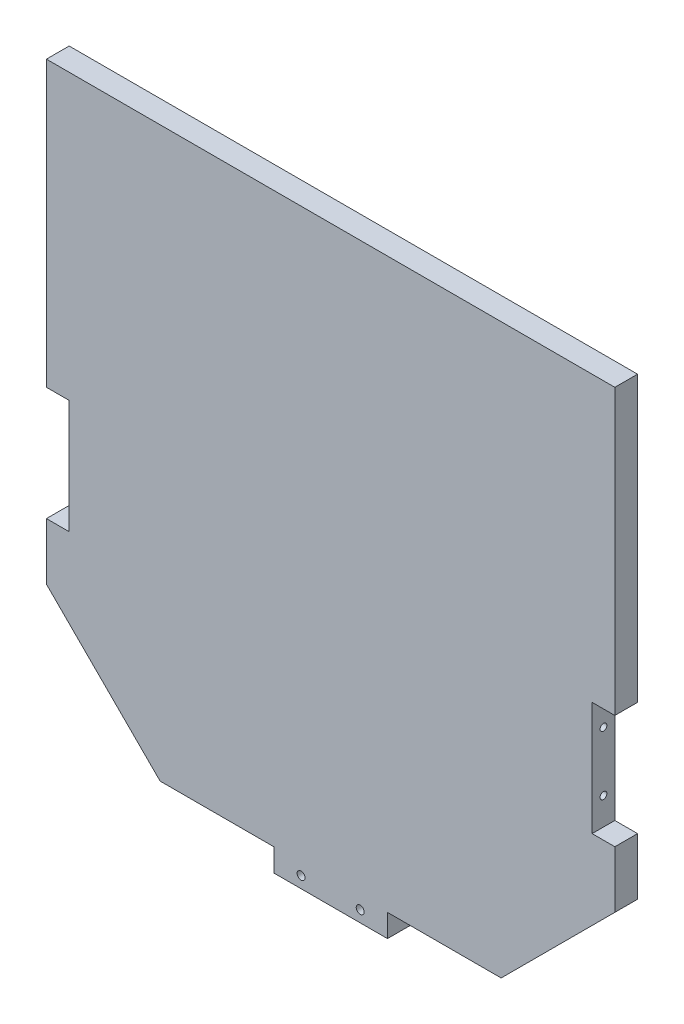
ISO-10303-21;
HEADER;
FILE_DESCRIPTION(('STEP AP214'),'2;1');
FILE_NAME('part.step','',(''),(''),'','','');
FILE_SCHEMA(('AUTOMOTIVE_DESIGN { 1 0 10303 214 1 1 1 1 }'));
ENDSEC;
DATA;
#1=APPLICATION_CONTEXT('core data for automotive mechanical design processes');
#2=APPLICATION_PROTOCOL_DEFINITION('international standard','automotive_design',2000,#1);
#3=PRODUCT_CONTEXT('',#1,'mechanical');
#4=PRODUCT('Part','Part','',(#3));
#5=PRODUCT_RELATED_PRODUCT_CATEGORY('part','',(#4));
#6=PRODUCT_DEFINITION_FORMATION('','',#4);
#7=PRODUCT_DEFINITION_CONTEXT('part definition',#1,'design');
#8=PRODUCT_DEFINITION('design','',#6,#7);
#9=PRODUCT_DEFINITION_SHAPE('','',#8);
#10=(LENGTH_UNIT() NAMED_UNIT(*) SI_UNIT(.MILLI.,.METRE.));
#11=(NAMED_UNIT(*) PLANE_ANGLE_UNIT() SI_UNIT($,.RADIAN.));
#12=(NAMED_UNIT(*) SI_UNIT($,.STERADIAN.) SOLID_ANGLE_UNIT());
#13=UNCERTAINTY_MEASURE_WITH_UNIT(LENGTH_MEASURE(1.E-05),#10,'distance_accuracy_value','');
#14=(GEOMETRIC_REPRESENTATION_CONTEXT(3) GLOBAL_UNCERTAINTY_ASSIGNED_CONTEXT((#13)) GLOBAL_UNIT_ASSIGNED_CONTEXT((#10,
#11,#12)) REPRESENTATION_CONTEXT('',''));
#15=CARTESIAN_POINT('',(0.,0.,0.));
#16=DIRECTION('',(0.,0.,1.));
#17=DIRECTION('',(1.,0.,0.));
#18=AXIS2_PLACEMENT_3D('',#15,#16,#17);
#19=CARTESIAN_POINT('',(-115.,75.,10.));
#20=DIRECTION('',(1.,0.,0.));
#21=DIRECTION('',(0.,0.,-1.));
#22=AXIS2_PLACEMENT_3D('',#19,#20,#21);
#23=PLANE('',#22);
#24=CARTESIAN_POINT('',(-115.,113.,5.));
#25=DIRECTION('',(1.,0.,0.));
#26=DIRECTION('',(0.,1.,0.));
#27=AXIS2_PLACEMENT_3D('',#24,#25,#26);
#28=CIRCLE('',#27,1.5);
#29=CARTESIAN_POINT('',(-115.,114.5,5.));
#30=VERTEX_POINT('',#29);
#31=EDGE_CURVE('E438',#30,#30,#28,.T.);
#32=ORIENTED_EDGE('',*,*,#31,.T.);
#33=EDGE_LOOP('',(#32));
#34=FACE_BOUND('',#33,.T.);
#35=DIRECTION('',(0.,-1.,0.));
#36=VECTOR('',#35,1.);
#37=CARTESIAN_POINT('',(-115.,75.,0.));
#38=LINE('',#37,#36);
#39=CARTESIAN_POINT('',(-115.,125.,0.));
#40=VERTEX_POINT('',#39);
#41=CARTESIAN_POINT('',(-115.,75.,0.));
#42=VERTEX_POINT('',#41);
#43=EDGE_CURVE('E217',#40,#42,#38,.T.);
#44=ORIENTED_EDGE('',*,*,#43,.T.);
#45=DIRECTION('',(0.,0.,-1.));
#46=VECTOR('',#45,1.);
#47=CARTESIAN_POINT('',(-115.,75.,10.));
#48=LINE('',#47,#46);
#49=CARTESIAN_POINT('',(-115.,75.,10.));
#50=VERTEX_POINT('',#49);
#51=EDGE_CURVE('E228',#50,#42,#48,.T.);
#52=ORIENTED_EDGE('',*,*,#51,.F.);
#53=DIRECTION('',(0.,-1.,0.));
#54=VECTOR('',#53,1.);
#55=CARTESIAN_POINT('',(-115.,75.,10.));
#56=LINE('',#55,#54);
#57=CARTESIAN_POINT('',(-115.,125.,10.));
#58=VERTEX_POINT('',#57);
#59=EDGE_CURVE('E308',#58,#50,#56,.T.);
#60=ORIENTED_EDGE('',*,*,#59,.F.);
#61=DIRECTION('',(0.,0.,-1.));
#62=VECTOR('',#61,1.);
#63=CARTESIAN_POINT('',(-115.,125.,10.));
#64=LINE('',#63,#62);
#65=EDGE_CURVE('E231',#58,#40,#64,.T.);
#66=ORIENTED_EDGE('',*,*,#65,.T.);
#67=EDGE_LOOP('',(#44,#52,#60,#66));
#68=FACE_BOUND('',#67,.T.);
#69=CARTESIAN_POINT('',(-115.,87.,5.));
#70=DIRECTION('',(1.,0.,0.));
#71=DIRECTION('',(0.,1.,0.));
#72=AXIS2_PLACEMENT_3D('',#69,#70,#71);
#73=CIRCLE('',#72,1.5);
#74=CARTESIAN_POINT('',(-115.,88.5,5.));
#75=VERTEX_POINT('',#74);
#76=EDGE_CURVE('E439',#75,#75,#73,.T.);
#77=ORIENTED_EDGE('',*,*,#76,.T.);
#78=EDGE_LOOP('',(#77));
#79=FACE_BOUND('',#78,.T.);
#80=ADVANCED_FACE('F31',(#34,#68,#79),#23,.F.);
#81=CARTESIAN_POINT('',(-25.,-10.,10.));
#82=DIRECTION('',(0.,0.,1.));
#83=DIRECTION('',(1.,0.,0.));
#84=AXIS2_PLACEMENT_3D('',#81,#82,#83);
#85=PLANE('',#84);
#86=CARTESIAN_POINT('',(-13.,-5.,10.));
#87=DIRECTION('',(0.,0.,1.));
#88=DIRECTION('',(1.,0.,0.));
#89=AXIS2_PLACEMENT_3D('',#86,#87,#88);
#90=CIRCLE('',#89,1.75);
#91=CARTESIAN_POINT('',(-11.25,-5.,10.));
#92=VERTEX_POINT('',#91);
#93=EDGE_CURVE('E193',#92,#92,#90,.T.);
#94=ORIENTED_EDGE('',*,*,#93,.F.);
#95=EDGE_LOOP('',(#94));
#96=FACE_BOUND('',#95,.T.);
#97=DIRECTION('',(0.,-1.,0.));
#98=VECTOR('',#97,1.);
#99=CARTESIAN_POINT('',(-25.,0.,10.));
#100=LINE('',#99,#98);
#101=CARTESIAN_POINT('',(-25.,0.,10.));
#102=VERTEX_POINT('',#101);
#103=CARTESIAN_POINT('',(-25.,-10.,10.));
#104=VERTEX_POINT('',#103);
#105=EDGE_CURVE('E224',#102,#104,#100,.T.);
#106=ORIENTED_EDGE('',*,*,#105,.T.);
#107=DIRECTION('',(1.,0.,0.));
#108=VECTOR('',#107,1.);
#109=CARTESIAN_POINT('',(-25.,-10.,10.));
#110=LINE('',#109,#108);
#111=CARTESIAN_POINT('',(25.,-10.,10.));
#112=VERTEX_POINT('',#111);
#113=EDGE_CURVE('E121',#104,#112,#110,.T.);
#114=ORIENTED_EDGE('',*,*,#113,.T.);
#115=DIRECTION('',(0.,1.,0.));
#116=VECTOR('',#115,1.);
#117=CARTESIAN_POINT('',(25.,0.,10.));
#118=LINE('',#117,#116);
#119=CARTESIAN_POINT('',(25.,0.,10.));
#120=VERTEX_POINT('',#119);
#121=EDGE_CURVE('E269',#112,#120,#118,.T.);
#122=ORIENTED_EDGE('',*,*,#121,.T.);
#123=DIRECTION('',(1.,0.,0.));
#124=VECTOR('',#123,1.);
#125=CARTESIAN_POINT('',(75.,0.,10.));
#126=LINE('',#125,#124);
#127=CARTESIAN_POINT('',(75.,0.,10.));
#128=VERTEX_POINT('',#127);
#129=EDGE_CURVE('E288',#120,#128,#126,.T.);
#130=ORIENTED_EDGE('',*,*,#129,.T.);
#131=DIRECTION('',(0.707106781186548,0.707106781186547,0.));
#132=VECTOR('',#131,1.);
#133=CARTESIAN_POINT('',(125.,50.,10.));
#134=LINE('',#133,#132);
#135=CARTESIAN_POINT('',(125.,50.,10.));
#136=VERTEX_POINT('',#135);
#137=EDGE_CURVE('E285',#128,#136,#134,.T.);
#138=ORIENTED_EDGE('',*,*,#137,.T.);
#139=DIRECTION('',(0.,1.,0.));
#140=VECTOR('',#139,1.);
#141=CARTESIAN_POINT('',(125.,75.,10.));
#142=LINE('',#141,#140);
#143=CARTESIAN_POINT('',(125.,75.,10.));
#144=VERTEX_POINT('',#143);
#145=EDGE_CURVE('E287',#136,#144,#142,.T.);
#146=ORIENTED_EDGE('',*,*,#145,.T.);
#147=DIRECTION('',(-1.,0.,0.));
#148=VECTOR('',#147,1.);
#149=CARTESIAN_POINT('',(125.,75.,10.));
#150=LINE('',#149,#148);
#151=CARTESIAN_POINT('',(115.,75.,10.));
#152=VERTEX_POINT('',#151);
#153=EDGE_CURVE('E290',#144,#152,#150,.T.);
#154=ORIENTED_EDGE('',*,*,#153,.T.);
#155=DIRECTION('',(0.,1.,0.));
#156=VECTOR('',#155,1.);
#157=CARTESIAN_POINT('',(115.,75.,10.));
#158=LINE('',#157,#156);
#159=CARTESIAN_POINT('',(115.,125.,10.));
#160=VERTEX_POINT('',#159);
#161=EDGE_CURVE('E296',#152,#160,#158,.T.);
#162=ORIENTED_EDGE('',*,*,#161,.T.);
#163=DIRECTION('',(1.,0.,0.));
#164=VECTOR('',#163,1.);
#165=CARTESIAN_POINT('',(115.,125.,10.));
#166=LINE('',#165,#164);
#167=CARTESIAN_POINT('',(125.,125.,10.));
#168=VERTEX_POINT('',#167);
#169=EDGE_CURVE('E298',#160,#168,#166,.T.);
#170=ORIENTED_EDGE('',*,*,#169,.T.);
#171=DIRECTION('',(0.,1.,0.));
#172=VECTOR('',#171,1.);
#173=CARTESIAN_POINT('',(125.,125.,10.));
#174=LINE('',#173,#172);
#175=CARTESIAN_POINT('',(125.,250.,10.));
#176=VERTEX_POINT('',#175);
#177=EDGE_CURVE('E300',#168,#176,#174,.T.);
#178=ORIENTED_EDGE('',*,*,#177,.T.);
#179=DIRECTION('',(-1.,0.,0.));
#180=VECTOR('',#179,1.);
#181=CARTESIAN_POINT('',(-125.,250.,10.));
#182=LINE('',#181,#180);
#183=CARTESIAN_POINT('',(-125.,250.,10.));
#184=VERTEX_POINT('',#183);
#185=EDGE_CURVE('E302',#176,#184,#182,.T.);
#186=ORIENTED_EDGE('',*,*,#185,.T.);
#187=DIRECTION('',(0.,-1.,0.));
#188=VECTOR('',#187,1.);
#189=CARTESIAN_POINT('',(-125.,125.,10.));
#190=LINE('',#189,#188);
#191=CARTESIAN_POINT('',(-125.,125.,10.));
#192=VERTEX_POINT('',#191);
#193=EDGE_CURVE('E304',#184,#192,#190,.T.);
#194=ORIENTED_EDGE('',*,*,#193,.T.);
#195=DIRECTION('',(1.,0.,0.));
#196=VECTOR('',#195,1.);
#197=CARTESIAN_POINT('',(-115.,125.,10.));
#198=LINE('',#197,#196);
#199=EDGE_CURVE('E306',#192,#58,#198,.T.);
#200=ORIENTED_EDGE('',*,*,#199,.T.);
#201=ORIENTED_EDGE('',*,*,#59,.T.);
#202=DIRECTION('',(-1.,0.,0.));
#203=VECTOR('',#202,1.);
#204=CARTESIAN_POINT('',(-125.,75.,10.));
#205=LINE('',#204,#203);
#206=CARTESIAN_POINT('',(-125.,75.,10.));
#207=VERTEX_POINT('',#206);
#208=EDGE_CURVE('E171',#50,#207,#205,.T.);
#209=ORIENTED_EDGE('',*,*,#208,.T.);
#210=DIRECTION('',(0.,-1.,0.));
#211=VECTOR('',#210,1.);
#212=CARTESIAN_POINT('',(-125.,75.,10.));
#213=LINE('',#212,#211);
#214=CARTESIAN_POINT('',(-125.,50.,10.));
#215=VERTEX_POINT('',#214);
#216=EDGE_CURVE('E164',#207,#215,#213,.T.);
#217=ORIENTED_EDGE('',*,*,#216,.T.);
#218=DIRECTION('',(0.707106781186548,-0.707106781186547,0.));
#219=VECTOR('',#218,1.);
#220=CARTESIAN_POINT('',(-125.,50.,10.));
#221=LINE('',#220,#219);
#222=CARTESIAN_POINT('',(-75.,0.,10.));
#223=VERTEX_POINT('',#222);
#224=EDGE_CURVE('E169',#215,#223,#221,.T.);
#225=ORIENTED_EDGE('',*,*,#224,.T.);
#226=DIRECTION('',(1.,0.,0.));
#227=VECTOR('',#226,1.);
#228=CARTESIAN_POINT('',(-75.,0.,10.));
#229=LINE('',#228,#227);
#230=EDGE_CURVE('E48',#223,#102,#229,.T.);
#231=ORIENTED_EDGE('',*,*,#230,.T.);
#232=EDGE_LOOP('',(#106,#114,#122,#130,#138,#146,#154,#162,#170,#178,#186,#194,#200,#201,#209,
#217,#225,#231));
#233=FACE_BOUND('',#232,.T.);
#234=CARTESIAN_POINT('',(13.,-5.,10.));
#235=DIRECTION('',(0.,0.,1.));
#236=DIRECTION('',(1.,0.,0.));
#237=AXIS2_PLACEMENT_3D('',#234,#235,#236);
#238=CIRCLE('',#237,1.75);
#239=CARTESIAN_POINT('',(14.75,-5.,10.));
#240=VERTEX_POINT('',#239);
#241=EDGE_CURVE('E461',#240,#240,#238,.T.);
#242=ORIENTED_EDGE('',*,*,#241,.F.);
#243=EDGE_LOOP('',(#242));
#244=FACE_BOUND('',#243,.T.);
#245=ADVANCED_FACE('F166',(#96,#233,#244),#85,.T.);
#246=CARTESIAN_POINT('',(-25.,-10.,0.));
#247=DIRECTION('',(0.,0.,1.));
#248=DIRECTION('',(1.,0.,0.));
#249=AXIS2_PLACEMENT_3D('',#246,#247,#248);
#250=PLANE('',#249);
#251=CARTESIAN_POINT('',(-13.,-5.,0.));
#252=DIRECTION('',(0.,0.,1.));
#253=DIRECTION('',(1.,0.,0.));
#254=AXIS2_PLACEMENT_3D('',#251,#252,#253);
#255=CIRCLE('',#254,1.75);
#256=CARTESIAN_POINT('',(-11.25,-5.,0.));
#257=VERTEX_POINT('',#256);
#258=EDGE_CURVE('E464',#257,#257,#255,.T.);
#259=ORIENTED_EDGE('',*,*,#258,.T.);
#260=EDGE_LOOP('',(#259));
#261=FACE_BOUND('',#260,.T.);
#262=DIRECTION('',(0.,-1.,0.));
#263=VECTOR('',#262,1.);
#264=CARTESIAN_POINT('',(-25.,0.,0.));
#265=LINE('',#264,#263);
#266=CARTESIAN_POINT('',(-25.,0.,0.));
#267=VERTEX_POINT('',#266);
#268=CARTESIAN_POINT('',(-25.,-10.,0.));
#269=VERTEX_POINT('',#268);
#270=EDGE_CURVE('E189',#267,#269,#265,.T.);
#271=ORIENTED_EDGE('',*,*,#270,.F.);
#272=DIRECTION('',(1.,0.,0.));
#273=VECTOR('',#272,1.);
#274=CARTESIAN_POINT('',(-75.,0.,0.));
#275=LINE('',#274,#273);
#276=CARTESIAN_POINT('',(-75.,0.,0.));
#277=VERTEX_POINT('',#276);
#278=EDGE_CURVE('E113',#277,#267,#275,.T.);
#279=ORIENTED_EDGE('',*,*,#278,.F.);
#280=DIRECTION('',(0.707106781186548,-0.707106781186547,0.));
#281=VECTOR('',#280,1.);
#282=CARTESIAN_POINT('',(-125.,50.,0.));
#283=LINE('',#282,#281);
#284=CARTESIAN_POINT('',(-125.,50.,0.));
#285=VERTEX_POINT('',#284);
#286=EDGE_CURVE('E107',#285,#277,#283,.T.);
#287=ORIENTED_EDGE('',*,*,#286,.F.);
#288=DIRECTION('',(0.,-1.,0.));
#289=VECTOR('',#288,1.);
#290=CARTESIAN_POINT('',(-125.,75.,0.));
#291=LINE('',#290,#289);
#292=CARTESIAN_POINT('',(-125.,75.,0.));
#293=VERTEX_POINT('',#292);
#294=EDGE_CURVE('E179',#293,#285,#291,.T.);
#295=ORIENTED_EDGE('',*,*,#294,.F.);
#296=DIRECTION('',(-1.,0.,0.));
#297=VECTOR('',#296,1.);
#298=CARTESIAN_POINT('',(-125.,75.,0.));
#299=LINE('',#298,#297);
#300=EDGE_CURVE('E219',#42,#293,#299,.T.);
#301=ORIENTED_EDGE('',*,*,#300,.F.);
#302=ORIENTED_EDGE('',*,*,#43,.F.);
#303=DIRECTION('',(1.,0.,0.));
#304=VECTOR('',#303,1.);
#305=CARTESIAN_POINT('',(-115.,125.,0.));
#306=LINE('',#305,#304);
#307=CARTESIAN_POINT('',(-125.,125.,0.));
#308=VERTEX_POINT('',#307);
#309=EDGE_CURVE('E215',#308,#40,#306,.T.);
#310=ORIENTED_EDGE('',*,*,#309,.F.);
#311=DIRECTION('',(0.,-1.,0.));
#312=VECTOR('',#311,1.);
#313=CARTESIAN_POINT('',(-125.,125.,0.));
#314=LINE('',#313,#312);
#315=CARTESIAN_POINT('',(-125.,250.,0.));
#316=VERTEX_POINT('',#315);
#317=EDGE_CURVE('E213',#316,#308,#314,.T.);
#318=ORIENTED_EDGE('',*,*,#317,.F.);
#319=DIRECTION('',(-1.,0.,0.));
#320=VECTOR('',#319,1.);
#321=CARTESIAN_POINT('',(-125.,250.,0.));
#322=LINE('',#321,#320);
#323=CARTESIAN_POINT('',(125.,250.,0.));
#324=VERTEX_POINT('',#323);
#325=EDGE_CURVE('E211',#324,#316,#322,.T.);
#326=ORIENTED_EDGE('',*,*,#325,.F.);
#327=DIRECTION('',(0.,1.,0.));
#328=VECTOR('',#327,1.);
#329=CARTESIAN_POINT('',(125.,125.,0.));
#330=LINE('',#329,#328);
#331=CARTESIAN_POINT('',(125.,125.,0.));
#332=VERTEX_POINT('',#331);
#333=EDGE_CURVE('E209',#332,#324,#330,.T.);
#334=ORIENTED_EDGE('',*,*,#333,.F.);
#335=DIRECTION('',(1.,0.,0.));
#336=VECTOR('',#335,1.);
#337=CARTESIAN_POINT('',(115.,125.,0.));
#338=LINE('',#337,#336);
#339=CARTESIAN_POINT('',(115.,125.,0.));
#340=VERTEX_POINT('',#339);
#341=EDGE_CURVE('E207',#340,#332,#338,.T.);
#342=ORIENTED_EDGE('',*,*,#341,.F.);
#343=DIRECTION('',(0.,1.,0.));
#344=VECTOR('',#343,1.);
#345=CARTESIAN_POINT('',(115.,75.,0.));
#346=LINE('',#345,#344);
#347=CARTESIAN_POINT('',(115.,75.,0.));
#348=VERTEX_POINT('',#347);
#349=EDGE_CURVE('E205',#348,#340,#346,.T.);
#350=ORIENTED_EDGE('',*,*,#349,.F.);
#351=DIRECTION('',(-1.,0.,0.));
#352=VECTOR('',#351,1.);
#353=CARTESIAN_POINT('',(125.,75.,0.));
#354=LINE('',#353,#352);
#355=CARTESIAN_POINT('',(125.,75.,0.));
#356=VERTEX_POINT('',#355);
#357=EDGE_CURVE('E203',#356,#348,#354,.T.);
#358=ORIENTED_EDGE('',*,*,#357,.F.);
#359=DIRECTION('',(0.,1.,0.));
#360=VECTOR('',#359,1.);
#361=CARTESIAN_POINT('',(125.,75.,0.));
#362=LINE('',#361,#360);
#363=CARTESIAN_POINT('',(125.,50.,0.));
#364=VERTEX_POINT('',#363);
#365=EDGE_CURVE('E201',#364,#356,#362,.T.);
#366=ORIENTED_EDGE('',*,*,#365,.F.);
#367=DIRECTION('',(0.707106781186548,0.707106781186547,0.));
#368=VECTOR('',#367,1.);
#369=CARTESIAN_POINT('',(125.,50.,0.));
#370=LINE('',#369,#368);
#371=CARTESIAN_POINT('',(75.,0.,0.));
#372=VERTEX_POINT('',#371);
#373=EDGE_CURVE('E199',#372,#364,#370,.T.);
#374=ORIENTED_EDGE('',*,*,#373,.F.);
#375=DIRECTION('',(1.,0.,0.));
#376=VECTOR('',#375,1.);
#377=CARTESIAN_POINT('',(75.,0.,0.));
#378=LINE('',#377,#376);
#379=CARTESIAN_POINT('',(25.,0.,0.));
#380=VERTEX_POINT('',#379);
#381=EDGE_CURVE('E197',#380,#372,#378,.T.);
#382=ORIENTED_EDGE('',*,*,#381,.F.);
#383=DIRECTION('',(0.,1.,0.));
#384=VECTOR('',#383,1.);
#385=CARTESIAN_POINT('',(25.,0.,0.));
#386=LINE('',#385,#384);
#387=CARTESIAN_POINT('',(25.,-10.,0.));
#388=VERTEX_POINT('',#387);
#389=EDGE_CURVE('E195',#388,#380,#386,.T.);
#390=ORIENTED_EDGE('',*,*,#389,.F.);
#391=DIRECTION('',(1.,0.,0.));
#392=VECTOR('',#391,1.);
#393=CARTESIAN_POINT('',(-25.,-10.,0.));
#394=LINE('',#393,#392);
#395=EDGE_CURVE('E192',#269,#388,#394,.T.);
#396=ORIENTED_EDGE('',*,*,#395,.F.);
#397=EDGE_LOOP('',(#271,#279,#287,#295,#301,#302,#310,#318,#326,#334,#342,#350,#358,#366,#374,
#382,#390,#396));
#398=FACE_BOUND('',#397,.T.);
#399=CARTESIAN_POINT('',(13.,-5.,0.));
#400=DIRECTION('',(0.,0.,1.));
#401=DIRECTION('',(1.,0.,0.));
#402=AXIS2_PLACEMENT_3D('',#399,#400,#401);
#403=CIRCLE('',#402,1.75);
#404=CARTESIAN_POINT('',(14.75,-5.,0.));
#405=VERTEX_POINT('',#404);
#406=EDGE_CURVE('E458',#405,#405,#403,.T.);
#407=ORIENTED_EDGE('',*,*,#406,.T.);
#408=EDGE_LOOP('',(#407));
#409=FACE_BOUND('',#408,.T.);
#410=ADVANCED_FACE('F273',(#261,#398,#409),#250,.F.);
#411=CARTESIAN_POINT('',(-25.,0.,10.));
#412=DIRECTION('',(1.,0.,0.));
#413=DIRECTION('',(0.,0.,-1.));
#414=AXIS2_PLACEMENT_3D('',#411,#412,#413);
#415=PLANE('',#414);
#416=ORIENTED_EDGE('',*,*,#270,.T.);
#417=DIRECTION('',(0.,0.,-1.));
#418=VECTOR('',#417,1.);
#419=CARTESIAN_POINT('',(-25.,-10.,10.));
#420=LINE('',#419,#418);
#421=EDGE_CURVE('E11',#104,#269,#420,.T.);
#422=ORIENTED_EDGE('',*,*,#421,.F.);
#423=ORIENTED_EDGE('',*,*,#105,.F.);
#424=DIRECTION('',(0.,0.,-1.));
#425=VECTOR('',#424,1.);
#426=CARTESIAN_POINT('',(-25.,0.,10.));
#427=LINE('',#426,#425);
#428=EDGE_CURVE('E185',#102,#267,#427,.T.);
#429=ORIENTED_EDGE('',*,*,#428,.T.);
#430=EDGE_LOOP('',(#416,#422,#423,#429));
#431=FACE_BOUND('',#430,.T.);
#432=ADVANCED_FACE('F33',(#431),#415,.F.);
#433=CARTESIAN_POINT('',(-25.,-10.,10.));
#434=DIRECTION('',(0.,1.,0.));
#435=DIRECTION('',(-1.,0.,0.));
#436=AXIS2_PLACEMENT_3D('',#433,#434,#435);
#437=PLANE('',#436);
#438=ORIENTED_EDGE('',*,*,#395,.T.);
#439=DIRECTION('',(0.,0.,-1.));
#440=VECTOR('',#439,1.);
#441=CARTESIAN_POINT('',(25.,-10.,10.));
#442=LINE('',#441,#440);
#443=EDGE_CURVE('E40',#112,#388,#442,.T.);
#444=ORIENTED_EDGE('',*,*,#443,.F.);
#445=ORIENTED_EDGE('',*,*,#113,.F.);
#446=ORIENTED_EDGE('',*,*,#421,.T.);
#447=EDGE_LOOP('',(#438,#444,#445,#446));
#448=FACE_BOUND('',#447,.T.);
#449=ADVANCED_FACE('F386',(#448),#437,.F.);
#450=CARTESIAN_POINT('',(25.,0.,10.));
#451=DIRECTION('',(-1.,0.,0.));
#452=DIRECTION('',(0.,-1.,0.));
#453=AXIS2_PLACEMENT_3D('',#450,#451,#452);
#454=PLANE('',#453);
#455=ORIENTED_EDGE('',*,*,#389,.T.);
#456=DIRECTION('',(0.,0.,-1.));
#457=VECTOR('',#456,1.);
#458=CARTESIAN_POINT('',(25.,0.,10.));
#459=LINE('',#458,#457);
#460=EDGE_CURVE('E261',#120,#380,#459,.T.);
#461=ORIENTED_EDGE('',*,*,#460,.F.);
#462=ORIENTED_EDGE('',*,*,#121,.F.);
#463=ORIENTED_EDGE('',*,*,#443,.T.);
#464=EDGE_LOOP('',(#455,#461,#462,#463));
#465=FACE_BOUND('',#464,.T.);
#466=ADVANCED_FACE('F267',(#465),#454,.F.);
#467=CARTESIAN_POINT('',(75.,0.,10.));
#468=DIRECTION('',(0.,1.,0.));
#469=DIRECTION('',(-1.,0.,0.));
#470=AXIS2_PLACEMENT_3D('',#467,#468,#469);
#471=PLANE('',#470);
#472=ORIENTED_EDGE('',*,*,#381,.T.);
#473=DIRECTION('',(0.,0.,-1.));
#474=VECTOR('',#473,1.);
#475=CARTESIAN_POINT('',(75.,0.,10.));
#476=LINE('',#475,#474);
#477=EDGE_CURVE('E258',#128,#372,#476,.T.);
#478=ORIENTED_EDGE('',*,*,#477,.F.);
#479=ORIENTED_EDGE('',*,*,#129,.F.);
#480=ORIENTED_EDGE('',*,*,#460,.T.);
#481=EDGE_LOOP('',(#472,#478,#479,#480));
#482=FACE_BOUND('',#481,.T.);
#483=ADVANCED_FACE('F279',(#482),#471,.F.);
#484=CARTESIAN_POINT('',(125.,50.,10.));
#485=DIRECTION('',(-0.707106781186547,0.707106781186548,0.));
#486=DIRECTION('',(-0.707106781186548,-0.707106781186547,0.));
#487=AXIS2_PLACEMENT_3D('',#484,#485,#486);
#488=PLANE('',#487);
#489=ORIENTED_EDGE('',*,*,#373,.T.);
#490=DIRECTION('',(0.,0.,-1.));
#491=VECTOR('',#490,1.);
#492=CARTESIAN_POINT('',(125.,50.,10.));
#493=LINE('',#492,#491);
#494=EDGE_CURVE('E255',#136,#364,#493,.T.);
#495=ORIENTED_EDGE('',*,*,#494,.F.);
#496=ORIENTED_EDGE('',*,*,#137,.F.);
#497=ORIENTED_EDGE('',*,*,#477,.T.);
#498=EDGE_LOOP('',(#489,#495,#496,#497));
#499=FACE_BOUND('',#498,.T.);
#500=ADVANCED_FACE('F283',(#499),#488,.F.);
#501=CARTESIAN_POINT('',(125.,75.,10.));
#502=DIRECTION('',(-1.,0.,0.));
#503=DIRECTION('',(0.,-1.,0.));
#504=AXIS2_PLACEMENT_3D('',#501,#502,#503);
#505=PLANE('',#504);
#506=ORIENTED_EDGE('',*,*,#365,.T.);
#507=DIRECTION('',(0.,0.,-1.));
#508=VECTOR('',#507,1.);
#509=CARTESIAN_POINT('',(125.,75.,10.));
#510=LINE('',#509,#508);
#511=EDGE_CURVE('E252',#144,#356,#510,.T.);
#512=ORIENTED_EDGE('',*,*,#511,.F.);
#513=ORIENTED_EDGE('',*,*,#145,.F.);
#514=ORIENTED_EDGE('',*,*,#494,.T.);
#515=EDGE_LOOP('',(#506,#512,#513,#514));
#516=FACE_BOUND('',#515,.T.);
#517=ADVANCED_FACE('F376',(#516),#505,.F.);
#518=CARTESIAN_POINT('',(125.,75.,10.));
#519=DIRECTION('',(0.,-1.,0.));
#520=DIRECTION('',(0.,0.,-1.));
#521=AXIS2_PLACEMENT_3D('',#518,#519,#520);
#522=PLANE('',#521);
#523=ORIENTED_EDGE('',*,*,#357,.T.);
#524=DIRECTION('',(0.,0.,-1.));
#525=VECTOR('',#524,1.);
#526=CARTESIAN_POINT('',(115.,75.,10.));
#527=LINE('',#526,#525);
#528=EDGE_CURVE('E249',#152,#348,#527,.T.);
#529=ORIENTED_EDGE('',*,*,#528,.F.);
#530=ORIENTED_EDGE('',*,*,#153,.F.);
#531=ORIENTED_EDGE('',*,*,#511,.T.);
#532=EDGE_LOOP('',(#523,#529,#530,#531));
#533=FACE_BOUND('',#532,.T.);
#534=ADVANCED_FACE('F372',(#533),#522,.F.);
#535=CARTESIAN_POINT('',(115.,75.,10.));
#536=DIRECTION('',(-1.,0.,0.));
#537=DIRECTION('',(0.,-1.,0.));
#538=AXIS2_PLACEMENT_3D('',#535,#536,#537);
#539=PLANE('',#538);
#540=CARTESIAN_POINT('',(115.,87.,5.));
#541=DIRECTION('',(1.,0.,0.));
#542=DIRECTION('',(0.,1.,0.));
#543=AXIS2_PLACEMENT_3D('',#540,#541,#542);
#544=CIRCLE('',#543,1.5);
#545=CARTESIAN_POINT('',(115.,88.5,5.));
#546=VERTEX_POINT('',#545);
#547=EDGE_CURVE('E447',#546,#546,#544,.T.);
#548=ORIENTED_EDGE('',*,*,#547,.F.);
#549=EDGE_LOOP('',(#548));
#550=FACE_BOUND('',#549,.T.);
#551=CARTESIAN_POINT('',(115.,113.,5.));
#552=DIRECTION('',(1.,0.,0.));
#553=DIRECTION('',(0.,1.,0.));
#554=AXIS2_PLACEMENT_3D('',#551,#552,#553);
#555=CIRCLE('',#554,1.5);
#556=CARTESIAN_POINT('',(115.,114.5,5.));
#557=VERTEX_POINT('',#556);
#558=EDGE_CURVE('E452',#557,#557,#555,.T.);
#559=ORIENTED_EDGE('',*,*,#558,.F.);
#560=EDGE_LOOP('',(#559));
#561=FACE_BOUND('',#560,.T.);
#562=ORIENTED_EDGE('',*,*,#349,.T.);
#563=DIRECTION('',(0.,0.,-1.));
#564=VECTOR('',#563,1.);
#565=CARTESIAN_POINT('',(115.,125.,10.));
#566=LINE('',#565,#564);
#567=EDGE_CURVE('E246',#160,#340,#566,.T.);
#568=ORIENTED_EDGE('',*,*,#567,.F.);
#569=ORIENTED_EDGE('',*,*,#161,.F.);
#570=ORIENTED_EDGE('',*,*,#528,.T.);
#571=EDGE_LOOP('',(#562,#568,#569,#570));
#572=FACE_BOUND('',#571,.T.);
#573=ADVANCED_FACE('F368',(#550,#561,#572),#539,.F.);
#574=CARTESIAN_POINT('',(115.,125.,10.));
#575=DIRECTION('',(0.,1.,0.));
#576=DIRECTION('',(0.,0.,1.));
#577=AXIS2_PLACEMENT_3D('',#574,#575,#576);
#578=PLANE('',#577);
#579=ORIENTED_EDGE('',*,*,#341,.T.);
#580=DIRECTION('',(0.,0.,-1.));
#581=VECTOR('',#580,1.);
#582=CARTESIAN_POINT('',(125.,125.,10.));
#583=LINE('',#582,#581);
#584=EDGE_CURVE('E243',#168,#332,#583,.T.);
#585=ORIENTED_EDGE('',*,*,#584,.F.);
#586=ORIENTED_EDGE('',*,*,#169,.F.);
#587=ORIENTED_EDGE('',*,*,#567,.T.);
#588=EDGE_LOOP('',(#579,#585,#586,#587));
#589=FACE_BOUND('',#588,.T.);
#590=ADVANCED_FACE('F364',(#589),#578,.F.);
#591=CARTESIAN_POINT('',(125.,125.,10.));
#592=DIRECTION('',(-1.,0.,0.));
#593=DIRECTION('',(0.,-1.,0.));
#594=AXIS2_PLACEMENT_3D('',#591,#592,#593);
#595=PLANE('',#594);
#596=ORIENTED_EDGE('',*,*,#333,.T.);
#597=DIRECTION('',(0.,0.,-1.));
#598=VECTOR('',#597,1.);
#599=CARTESIAN_POINT('',(125.,250.,10.));
#600=LINE('',#599,#598);
#601=EDGE_CURVE('E240',#176,#324,#600,.T.);
#602=ORIENTED_EDGE('',*,*,#601,.F.);
#603=ORIENTED_EDGE('',*,*,#177,.F.);
#604=ORIENTED_EDGE('',*,*,#584,.T.);
#605=EDGE_LOOP('',(#596,#602,#603,#604));
#606=FACE_BOUND('',#605,.T.);
#607=ADVANCED_FACE('F360',(#606),#595,.F.);
#608=CARTESIAN_POINT('',(-125.,250.,10.));
#609=DIRECTION('',(0.,-1.,0.));
#610=DIRECTION('',(1.,0.,0.));
#611=AXIS2_PLACEMENT_3D('',#608,#609,#610);
#612=PLANE('',#611);
#613=ORIENTED_EDGE('',*,*,#325,.T.);
#614=DIRECTION('',(0.,0.,-1.));
#615=VECTOR('',#614,1.);
#616=CARTESIAN_POINT('',(-125.,250.,10.));
#617=LINE('',#616,#615);
#618=EDGE_CURVE('E237',#184,#316,#617,.T.);
#619=ORIENTED_EDGE('',*,*,#618,.F.);
#620=ORIENTED_EDGE('',*,*,#185,.F.);
#621=ORIENTED_EDGE('',*,*,#601,.T.);
#622=EDGE_LOOP('',(#613,#619,#620,#621));
#623=FACE_BOUND('',#622,.T.);
#624=ADVANCED_FACE('F356',(#623),#612,.F.);
#625=CARTESIAN_POINT('',(-125.,125.,10.));
#626=DIRECTION('',(1.,0.,0.));
#627=DIRECTION('',(0.,1.,0.));
#628=AXIS2_PLACEMENT_3D('',#625,#626,#627);
#629=PLANE('',#628);
#630=ORIENTED_EDGE('',*,*,#317,.T.);
#631=DIRECTION('',(0.,0.,-1.));
#632=VECTOR('',#631,1.);
#633=CARTESIAN_POINT('',(-125.,125.,10.));
#634=LINE('',#633,#632);
#635=EDGE_CURVE('E234',#192,#308,#634,.T.);
#636=ORIENTED_EDGE('',*,*,#635,.F.);
#637=ORIENTED_EDGE('',*,*,#193,.F.);
#638=ORIENTED_EDGE('',*,*,#618,.T.);
#639=EDGE_LOOP('',(#630,#636,#637,#638));
#640=FACE_BOUND('',#639,.T.);
#641=ADVANCED_FACE('F352',(#640),#629,.F.);
#642=CARTESIAN_POINT('',(-115.,125.,10.));
#643=DIRECTION('',(0.,1.,0.));
#644=DIRECTION('',(0.,0.,1.));
#645=AXIS2_PLACEMENT_3D('',#642,#643,#644);
#646=PLANE('',#645);
#647=ORIENTED_EDGE('',*,*,#309,.T.);
#648=ORIENTED_EDGE('',*,*,#65,.F.);
#649=ORIENTED_EDGE('',*,*,#199,.F.);
#650=ORIENTED_EDGE('',*,*,#635,.T.);
#651=EDGE_LOOP('',(#647,#648,#649,#650));
#652=FACE_BOUND('',#651,.T.);
#653=ADVANCED_FACE('F349',(#652),#646,.F.);
#654=CARTESIAN_POINT('',(-125.,75.,10.));
#655=DIRECTION('',(0.,-1.,0.));
#656=DIRECTION('',(0.,0.,-1.));
#657=AXIS2_PLACEMENT_3D('',#654,#655,#656);
#658=PLANE('',#657);
#659=ORIENTED_EDGE('',*,*,#300,.T.);
#660=DIRECTION('',(0.,0.,-1.));
#661=VECTOR('',#660,1.);
#662=CARTESIAN_POINT('',(-125.,75.,10.));
#663=LINE('',#662,#661);
#664=EDGE_CURVE('E180',#207,#293,#663,.T.);
#665=ORIENTED_EDGE('',*,*,#664,.F.);
#666=ORIENTED_EDGE('',*,*,#208,.F.);
#667=ORIENTED_EDGE('',*,*,#51,.T.);
#668=EDGE_LOOP('',(#659,#665,#666,#667));
#669=FACE_BOUND('',#668,.T.);
#670=ADVANCED_FACE('F318',(#669),#658,.F.);
#671=CARTESIAN_POINT('',(-125.,75.,10.));
#672=DIRECTION('',(1.,0.,0.));
#673=DIRECTION('',(0.,1.,0.));
#674=AXIS2_PLACEMENT_3D('',#671,#672,#673);
#675=PLANE('',#674);
#676=ORIENTED_EDGE('',*,*,#294,.T.);
#677=DIRECTION('',(0.,0.,-1.));
#678=VECTOR('',#677,1.);
#679=CARTESIAN_POINT('',(-125.,50.,10.));
#680=LINE('',#679,#678);
#681=EDGE_CURVE('E176',#215,#285,#680,.T.);
#682=ORIENTED_EDGE('',*,*,#681,.F.);
#683=ORIENTED_EDGE('',*,*,#216,.F.);
#684=ORIENTED_EDGE('',*,*,#664,.T.);
#685=EDGE_LOOP('',(#676,#682,#683,#684));
#686=FACE_BOUND('',#685,.T.);
#687=ADVANCED_FACE('F177',(#686),#675,.F.);
#688=CARTESIAN_POINT('',(-125.,50.,10.));
#689=DIRECTION('',(0.707106781186547,0.707106781186548,0.));
#690=DIRECTION('',(-0.707106781186548,0.707106781186547,0.));
#691=AXIS2_PLACEMENT_3D('',#688,#689,#690);
#692=PLANE('',#691);
#693=ORIENTED_EDGE('',*,*,#286,.T.);
#694=DIRECTION('',(0.,0.,-1.));
#695=VECTOR('',#694,1.);
#696=CARTESIAN_POINT('',(-75.,0.,10.));
#697=LINE('',#696,#695);
#698=EDGE_CURVE('E181',#223,#277,#697,.T.);
#699=ORIENTED_EDGE('',*,*,#698,.F.);
#700=ORIENTED_EDGE('',*,*,#224,.F.);
#701=ORIENTED_EDGE('',*,*,#681,.T.);
#702=EDGE_LOOP('',(#693,#699,#700,#701));
#703=FACE_BOUND('',#702,.T.);
#704=ADVANCED_FACE('F183',(#703),#692,.F.);
#705=CARTESIAN_POINT('',(-75.,0.,10.));
#706=DIRECTION('',(0.,1.,0.));
#707=DIRECTION('',(0.,0.,1.));
#708=AXIS2_PLACEMENT_3D('',#705,#706,#707);
#709=PLANE('',#708);
#710=ORIENTED_EDGE('',*,*,#278,.T.);
#711=ORIENTED_EDGE('',*,*,#428,.F.);
#712=ORIENTED_EDGE('',*,*,#230,.F.);
#713=ORIENTED_EDGE('',*,*,#698,.T.);
#714=EDGE_LOOP('',(#710,#711,#712,#713));
#715=FACE_BOUND('',#714,.T.);
#716=ADVANCED_FACE('F322',(#715),#709,.F.);
#717=CARTESIAN_POINT('',(-13.,-5.,10.));
#718=DIRECTION('',(0.,0.,-1.));
#719=DIRECTION('',(-1.,0.,0.));
#720=AXIS2_PLACEMENT_3D('',#717,#718,#719);
#721=CYLINDRICAL_SURFACE('',#720,1.75);
#722=ORIENTED_EDGE('',*,*,#93,.T.);
#723=EDGE_LOOP('',(#722));
#724=FACE_BOUND('',#723,.T.);
#725=ORIENTED_EDGE('',*,*,#258,.F.);
#726=EDGE_LOOP('',(#725));
#727=FACE_BOUND('',#726,.T.);
#728=ADVANCED_FACE('F324',(#724,#727),#721,.F.);
#729=CARTESIAN_POINT('',(13.,-5.,10.));
#730=DIRECTION('',(0.,0.,-1.));
#731=DIRECTION('',(-1.,0.,0.));
#732=AXIS2_PLACEMENT_3D('',#729,#730,#731);
#733=CYLINDRICAL_SURFACE('',#732,1.75);
#734=ORIENTED_EDGE('',*,*,#241,.T.);
#735=EDGE_LOOP('',(#734));
#736=FACE_BOUND('',#735,.T.);
#737=ORIENTED_EDGE('',*,*,#406,.F.);
#738=EDGE_LOOP('',(#737));
#739=FACE_BOUND('',#738,.T.);
#740=ADVANCED_FACE('F330',(#736,#739),#733,.F.);
#741=CARTESIAN_POINT('',(100.,113.,5.));
#742=DIRECTION('',(1.,0.,0.));
#743=DIRECTION('',(0.,1.,0.));
#744=AXIS2_PLACEMENT_3D('',#741,#742,#743);
#745=CYLINDRICAL_SURFACE('',#744,1.5);
#746=CARTESIAN_POINT('',(100.,113.,5.));
#747=DIRECTION('',(1.,0.,0.));
#748=DIRECTION('',(0.,1.,0.));
#749=AXIS2_PLACEMENT_3D('',#746,#747,#748);
#750=CIRCLE('',#749,1.5);
#751=CARTESIAN_POINT('',(100.,114.5,5.));
#752=VERTEX_POINT('',#751);
#753=EDGE_CURVE('E455',#752,#752,#750,.T.);
#754=ORIENTED_EDGE('',*,*,#753,.F.);
#755=EDGE_LOOP('',(#754));
#756=FACE_BOUND('',#755,.T.);
#757=ORIENTED_EDGE('',*,*,#558,.T.);
#758=EDGE_LOOP('',(#757));
#759=FACE_BOUND('',#758,.T.);
#760=ADVANCED_FACE('F401',(#756,#759),#745,.F.);
#761=CARTESIAN_POINT('',(100.,113.,5.));
#762=DIRECTION('',(1.,0.,0.));
#763=DIRECTION('',(0.,1.,0.));
#764=AXIS2_PLACEMENT_3D('',#761,#762,#763);
#765=PLANE('',#764);
#766=ORIENTED_EDGE('',*,*,#753,.T.);
#767=EDGE_LOOP('',(#766));
#768=FACE_BOUND('',#767,.T.);
#769=ADVANCED_FACE('F405',(#768),#765,.T.);
#770=CARTESIAN_POINT('',(100.,87.,5.));
#771=DIRECTION('',(1.,0.,0.));
#772=DIRECTION('',(0.,1.,0.));
#773=AXIS2_PLACEMENT_3D('',#770,#771,#772);
#774=CYLINDRICAL_SURFACE('',#773,1.5);
#775=CARTESIAN_POINT('',(100.,87.,5.));
#776=DIRECTION('',(1.,0.,0.));
#777=DIRECTION('',(0.,1.,0.));
#778=AXIS2_PLACEMENT_3D('',#775,#776,#777);
#779=CIRCLE('',#778,1.5);
#780=CARTESIAN_POINT('',(100.,88.5,5.));
#781=VERTEX_POINT('',#780);
#782=EDGE_CURVE('E449',#781,#781,#779,.T.);
#783=ORIENTED_EDGE('',*,*,#782,.F.);
#784=EDGE_LOOP('',(#783));
#785=FACE_BOUND('',#784,.T.);
#786=ORIENTED_EDGE('',*,*,#547,.T.);
#787=EDGE_LOOP('',(#786));
#788=FACE_BOUND('',#787,.T.);
#789=ADVANCED_FACE('F409',(#785,#788),#774,.F.);
#790=CARTESIAN_POINT('',(100.,87.,5.));
#791=DIRECTION('',(1.,0.,0.));
#792=DIRECTION('',(0.,1.,0.));
#793=AXIS2_PLACEMENT_3D('',#790,#791,#792);
#794=PLANE('',#793);
#795=ORIENTED_EDGE('',*,*,#782,.T.);
#796=EDGE_LOOP('',(#795));
#797=FACE_BOUND('',#796,.T.);
#798=ADVANCED_FACE('F413',(#797),#794,.T.);
#799=CARTESIAN_POINT('',(-100.,113.,5.));
#800=DIRECTION('',(-1.,0.,0.));
#801=DIRECTION('',(0.,-1.,0.));
#802=AXIS2_PLACEMENT_3D('',#799,#800,#801);
#803=CYLINDRICAL_SURFACE('',#802,1.5);
#804=CARTESIAN_POINT('',(-100.,113.,5.));
#805=DIRECTION('',(1.,0.,0.));
#806=DIRECTION('',(0.,1.,0.));
#807=AXIS2_PLACEMENT_3D('',#804,#805,#806);
#808=CIRCLE('',#807,1.5);
#809=CARTESIAN_POINT('',(-100.,114.5,5.));
#810=VERTEX_POINT('',#809);
#811=EDGE_CURVE('E441',#810,#810,#808,.T.);
#812=ORIENTED_EDGE('',*,*,#811,.T.);
#813=EDGE_LOOP('',(#812));
#814=FACE_BOUND('',#813,.T.);
#815=ORIENTED_EDGE('',*,*,#31,.F.);
#816=EDGE_LOOP('',(#815));
#817=FACE_BOUND('',#816,.T.);
#818=ADVANCED_FACE('F417',(#814,#817),#803,.F.);
#819=CARTESIAN_POINT('',(-100.,113.,5.));
#820=DIRECTION('',(-1.,0.,0.));
#821=DIRECTION('',(0.,1.,0.));
#822=AXIS2_PLACEMENT_3D('',#819,#820,#821);
#823=PLANE('',#822);
#824=ORIENTED_EDGE('',*,*,#811,.F.);
#825=EDGE_LOOP('',(#824));
#826=FACE_BOUND('',#825,.T.);
#827=ADVANCED_FACE('F421',(#826),#823,.T.);
#828=CARTESIAN_POINT('',(-100.,87.,5.));
#829=DIRECTION('',(-1.,0.,0.));
#830=DIRECTION('',(0.,-1.,0.));
#831=AXIS2_PLACEMENT_3D('',#828,#829,#830);
#832=CYLINDRICAL_SURFACE('',#831,1.5);
#833=CARTESIAN_POINT('',(-100.,87.,5.));
#834=DIRECTION('',(1.,0.,0.));
#835=DIRECTION('',(0.,1.,0.));
#836=AXIS2_PLACEMENT_3D('',#833,#834,#835);
#837=CIRCLE('',#836,1.5);
#838=CARTESIAN_POINT('',(-100.,88.5,5.));
#839=VERTEX_POINT('',#838);
#840=EDGE_CURVE('E437',#839,#839,#837,.T.);
#841=ORIENTED_EDGE('',*,*,#840,.T.);
#842=EDGE_LOOP('',(#841));
#843=FACE_BOUND('',#842,.T.);
#844=ORIENTED_EDGE('',*,*,#76,.F.);
#845=EDGE_LOOP('',(#844));
#846=FACE_BOUND('',#845,.T.);
#847=ADVANCED_FACE('F425',(#843,#846),#832,.F.);
#848=CARTESIAN_POINT('',(-100.,87.,5.));
#849=DIRECTION('',(-1.,0.,0.));
#850=DIRECTION('',(0.,1.,0.));
#851=AXIS2_PLACEMENT_3D('',#848,#849,#850);
#852=PLANE('',#851);
#853=ORIENTED_EDGE('',*,*,#840,.F.);
#854=EDGE_LOOP('',(#853));
#855=FACE_BOUND('',#854,.T.);
#856=ADVANCED_FACE('F429',(#855),#852,.T.);
#857=CLOSED_SHELL('',(#80,#245,#410,#432,#449,#466,#483,#500,#517,#534,#573,#590,#607,#624,#641,
#653,#670,#687,#704,#716,#728,#740,#760,#769,#789,#798,#818,#827,#847,#856));
#858=MANIFOLD_SOLID_BREP('B2',#857);
#859=ADVANCED_BREP_SHAPE_REPRESENTATION('',(#18,#858),#14);
#860=SHAPE_DEFINITION_REPRESENTATION(#9,#859);
ENDSEC;
END-ISO-10303-21;
